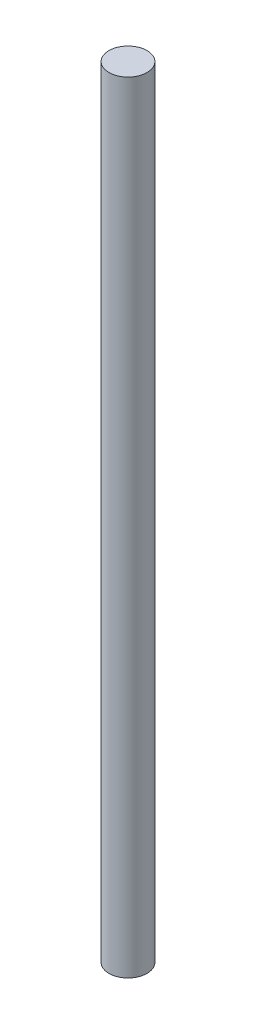
ISO-10303-21;
HEADER;
FILE_DESCRIPTION(('STEP AP214'),'2;1');
FILE_NAME('part.step','',(''),(''),'','','');
FILE_SCHEMA(('AUTOMOTIVE_DESIGN { 1 0 10303 214 1 1 1 1 }'));
ENDSEC;
DATA;
#1=APPLICATION_CONTEXT('core data for automotive mechanical design processes');
#2=APPLICATION_PROTOCOL_DEFINITION('international standard','automotive_design',2000,#1);
#3=PRODUCT_CONTEXT('',#1,'mechanical');
#4=PRODUCT('Part','Part','',(#3));
#5=PRODUCT_RELATED_PRODUCT_CATEGORY('part','',(#4));
#6=PRODUCT_DEFINITION_FORMATION('','',#4);
#7=PRODUCT_DEFINITION_CONTEXT('part definition',#1,'design');
#8=PRODUCT_DEFINITION('design','',#6,#7);
#9=PRODUCT_DEFINITION_SHAPE('','',#8);
#10=(LENGTH_UNIT() NAMED_UNIT(*) SI_UNIT(.MILLI.,.METRE.));
#11=(NAMED_UNIT(*) PLANE_ANGLE_UNIT() SI_UNIT($,.RADIAN.));
#12=(NAMED_UNIT(*) SI_UNIT($,.STERADIAN.) SOLID_ANGLE_UNIT());
#13=UNCERTAINTY_MEASURE_WITH_UNIT(LENGTH_MEASURE(1.E-05),#10,'distance_accuracy_value','');
#14=(GEOMETRIC_REPRESENTATION_CONTEXT(3) GLOBAL_UNCERTAINTY_ASSIGNED_CONTEXT((#13)) GLOBAL_UNIT_ASSIGNED_CONTEXT((#10,
#11,#12)) REPRESENTATION_CONTEXT('',''));
#15=CARTESIAN_POINT('',(0.,0.,0.));
#16=DIRECTION('',(0.,0.,1.));
#17=DIRECTION('',(1.,0.,0.));
#18=AXIS2_PLACEMENT_3D('',#15,#16,#17);
#19=CARTESIAN_POINT('',(0.,41.,0.));
#20=DIRECTION('',(0.,-1.,0.));
#21=DIRECTION('',(0.,0.,-1.));
#22=AXIS2_PLACEMENT_3D('',#19,#20,#21);
#23=CYLINDRICAL_SURFACE('',#22,1.);
#24=CARTESIAN_POINT('',(0.,41.,0.));
#25=DIRECTION('',(0.,1.,0.));
#26=DIRECTION('',(0.,0.,1.));
#27=AXIS2_PLACEMENT_3D('',#24,#25,#26);
#28=CIRCLE('',#27,1.);
#29=CARTESIAN_POINT('',(0.,41.,1.));
#30=VERTEX_POINT('',#29);
#31=EDGE_CURVE('E10',#30,#30,#28,.T.);
#32=ORIENTED_EDGE('',*,*,#31,.F.);
#33=EDGE_LOOP('',(#32));
#34=FACE_BOUND('',#33,.T.);
#35=CARTESIAN_POINT('',(0.,0.,0.));
#36=DIRECTION('',(0.,1.,0.));
#37=DIRECTION('',(0.,0.,1.));
#38=AXIS2_PLACEMENT_3D('',#35,#36,#37);
#39=CIRCLE('',#38,1.);
#40=CARTESIAN_POINT('',(0.,0.,1.));
#41=VERTEX_POINT('',#40);
#42=EDGE_CURVE('E42',#41,#41,#39,.T.);
#43=ORIENTED_EDGE('',*,*,#42,.T.);
#44=EDGE_LOOP('',(#43));
#45=FACE_BOUND('',#44,.T.);
#46=ADVANCED_FACE('F39',(#34,#45),#23,.T.);
#47=CARTESIAN_POINT('',(0.,41.,0.));
#48=DIRECTION('',(0.,1.,0.));
#49=DIRECTION('',(0.,0.,1.));
#50=AXIS2_PLACEMENT_3D('',#47,#48,#49);
#51=PLANE('',#50);
#52=ORIENTED_EDGE('',*,*,#31,.T.);
#53=EDGE_LOOP('',(#52));
#54=FACE_BOUND('',#53,.T.);
#55=ADVANCED_FACE('F54',(#54),#51,.T.);
#56=CARTESIAN_POINT('',(0.,0.,0.));
#57=DIRECTION('',(0.,1.,0.));
#58=DIRECTION('',(0.,0.,1.));
#59=AXIS2_PLACEMENT_3D('',#56,#57,#58);
#60=PLANE('',#59);
#61=ORIENTED_EDGE('',*,*,#42,.F.);
#62=EDGE_LOOP('',(#61));
#63=FACE_BOUND('',#62,.T.);
#64=ADVANCED_FACE('F52',(#63),#60,.F.);
#65=CLOSED_SHELL('',(#46,#55,#64));
#66=MANIFOLD_SOLID_BREP('B2',#65);
#67=ADVANCED_BREP_SHAPE_REPRESENTATION('',(#18,#66),#14);
#68=SHAPE_DEFINITION_REPRESENTATION(#9,#67);
ENDSEC;
END-ISO-10303-21;
